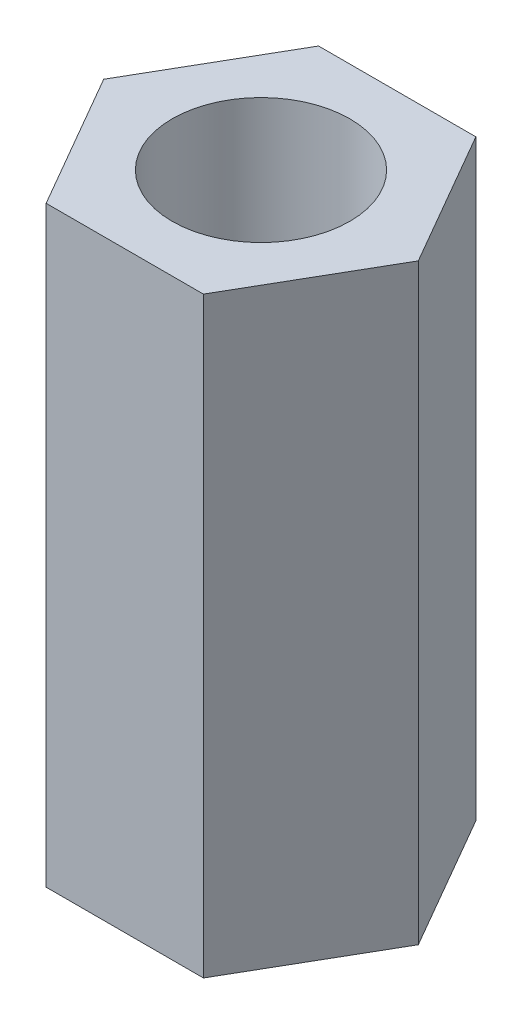
ISO-10303-21;
HEADER;
FILE_DESCRIPTION(('STEP AP214'),'2;1');
FILE_NAME('part.step','',(''),(''),'','','');
FILE_SCHEMA(('AUTOMOTIVE_DESIGN { 1 0 10303 214 1 1 1 1 }'));
ENDSEC;
DATA;
#1=APPLICATION_CONTEXT('core data for automotive mechanical design processes');
#2=APPLICATION_PROTOCOL_DEFINITION('international standard','automotive_design',2000,#1);
#3=PRODUCT_CONTEXT('',#1,'mechanical');
#4=PRODUCT('Part','Part','',(#3));
#5=PRODUCT_RELATED_PRODUCT_CATEGORY('part','',(#4));
#6=PRODUCT_DEFINITION_FORMATION('','',#4);
#7=PRODUCT_DEFINITION_CONTEXT('part definition',#1,'design');
#8=PRODUCT_DEFINITION('design','',#6,#7);
#9=PRODUCT_DEFINITION_SHAPE('','',#8);
#10=(LENGTH_UNIT() NAMED_UNIT(*) SI_UNIT(.MILLI.,.METRE.));
#11=(NAMED_UNIT(*) PLANE_ANGLE_UNIT() SI_UNIT($,.RADIAN.));
#12=(NAMED_UNIT(*) SI_UNIT($,.STERADIAN.) SOLID_ANGLE_UNIT());
#13=UNCERTAINTY_MEASURE_WITH_UNIT(LENGTH_MEASURE(1.E-05),#10,'distance_accuracy_value','');
#14=(GEOMETRIC_REPRESENTATION_CONTEXT(3) GLOBAL_UNCERTAINTY_ASSIGNED_CONTEXT((#13)) GLOBAL_UNIT_ASSIGNED_CONTEXT((#10,
#11,#12)) REPRESENTATION_CONTEXT('',''));
#15=CARTESIAN_POINT('',(0.,0.,0.));
#16=DIRECTION('',(0.,0.,1.));
#17=DIRECTION('',(1.,0.,0.));
#18=AXIS2_PLACEMENT_3D('',#15,#16,#17);
#19=CARTESIAN_POINT('',(0.,10.,0.));
#20=DIRECTION('',(0.,1.,0.));
#21=DIRECTION('',(0.,0.,1.));
#22=AXIS2_PLACEMENT_3D('',#19,#20,#21);
#23=PLANE('',#22);
#24=DIRECTION('',(1.,0.,0.));
#25=VECTOR('',#24,1.);
#26=CARTESIAN_POINT('',(-1.32790561913614,10.,2.3));
#27=LINE('',#26,#25);
#28=CARTESIAN_POINT('',(-1.32790561913614,10.,2.3));
#29=VERTEX_POINT('',#28);
#30=CARTESIAN_POINT('',(1.32790561913614,10.,2.3));
#31=VERTEX_POINT('',#30);
#32=EDGE_CURVE('E139',#29,#31,#27,.T.);
#33=ORIENTED_EDGE('',*,*,#32,.T.);
#34=DIRECTION('',(0.5,0.,-0.866025403784439));
#35=VECTOR('',#34,1.);
#36=CARTESIAN_POINT('',(1.32790561913614,10.,2.3));
#37=LINE('',#36,#35);
#38=CARTESIAN_POINT('',(2.65581123827228,10.,0.));
#39=VERTEX_POINT('',#38);
#40=EDGE_CURVE('E92',#31,#39,#37,.T.);
#41=ORIENTED_EDGE('',*,*,#40,.T.);
#42=DIRECTION('',(-0.5,0.,-0.866025403784438));
#43=VECTOR('',#42,1.);
#44=CARTESIAN_POINT('',(2.65581123827228,10.,0.));
#45=LINE('',#44,#43);
#46=CARTESIAN_POINT('',(1.32790561913614,10.,-2.3));
#47=VERTEX_POINT('',#46);
#48=EDGE_CURVE('E107',#39,#47,#45,.T.);
#49=ORIENTED_EDGE('',*,*,#48,.T.);
#50=DIRECTION('',(-1.,0.,0.));
#51=VECTOR('',#50,1.);
#52=CARTESIAN_POINT('',(1.32790561913614,10.,-2.3));
#53=LINE('',#52,#51);
#54=CARTESIAN_POINT('',(-1.32790561913614,10.,-2.3));
#55=VERTEX_POINT('',#54);
#56=EDGE_CURVE('E105',#47,#55,#53,.T.);
#57=ORIENTED_EDGE('',*,*,#56,.T.);
#58=DIRECTION('',(-0.5,0.,0.866025403784439));
#59=VECTOR('',#58,1.);
#60=CARTESIAN_POINT('',(-1.32790561913614,10.,-2.3));
#61=LINE('',#60,#59);
#62=CARTESIAN_POINT('',(-2.65581123827228,10.,0.));
#63=VERTEX_POINT('',#62);
#64=EDGE_CURVE('E106',#55,#63,#61,.T.);
#65=ORIENTED_EDGE('',*,*,#64,.T.);
#66=DIRECTION('',(0.5,0.,0.866025403784439));
#67=VECTOR('',#66,1.);
#68=CARTESIAN_POINT('',(-2.65581123827228,10.,0.));
#69=LINE('',#68,#67);
#70=EDGE_CURVE('E59',#63,#29,#69,.T.);
#71=ORIENTED_EDGE('',*,*,#70,.T.);
#72=EDGE_LOOP('',(#33,#41,#49,#57,#65,#71));
#73=FACE_BOUND('',#72,.T.);
#74=CARTESIAN_POINT('',(0.,10.,0.));
#75=DIRECTION('',(0.,1.,0.));
#76=DIRECTION('',(0.,0.,1.));
#77=AXIS2_PLACEMENT_3D('',#74,#75,#76);
#78=CIRCLE('',#77,1.5);
#79=CARTESIAN_POINT('',(0.,10.,1.5));
#80=VERTEX_POINT('',#79);
#81=EDGE_CURVE('E128',#80,#80,#78,.T.);
#82=ORIENTED_EDGE('',*,*,#81,.F.);
#83=EDGE_LOOP('',(#82));
#84=FACE_BOUND('',#83,.T.);
#85=ADVANCED_FACE('F41',(#73,#84),#23,.T.);
#86=CARTESIAN_POINT('',(0.,0.,0.));
#87=DIRECTION('',(0.,1.,0.));
#88=DIRECTION('',(0.,0.,1.));
#89=AXIS2_PLACEMENT_3D('',#86,#87,#88);
#90=PLANE('',#89);
#91=DIRECTION('',(1.,0.,0.));
#92=VECTOR('',#91,1.);
#93=CARTESIAN_POINT('',(-1.32790561913614,0.,2.3));
#94=LINE('',#93,#92);
#95=CARTESIAN_POINT('',(-1.32790561913614,0.,2.3));
#96=VERTEX_POINT('',#95);
#97=CARTESIAN_POINT('',(1.32790561913614,0.,2.3));
#98=VERTEX_POINT('',#97);
#99=EDGE_CURVE('E127',#96,#98,#94,.T.);
#100=ORIENTED_EDGE('',*,*,#99,.F.);
#101=DIRECTION('',(0.5,0.,0.866025403784439));
#102=VECTOR('',#101,1.);
#103=CARTESIAN_POINT('',(-2.65581123827228,0.,0.));
#104=LINE('',#103,#102);
#105=CARTESIAN_POINT('',(-2.65581123827228,0.,0.));
#106=VERTEX_POINT('',#105);
#107=EDGE_CURVE('E87',#106,#96,#104,.T.);
#108=ORIENTED_EDGE('',*,*,#107,.F.);
#109=DIRECTION('',(-0.5,0.,0.866025403784439));
#110=VECTOR('',#109,1.);
#111=CARTESIAN_POINT('',(-1.32790561913614,0.,-2.3));
#112=LINE('',#111,#110);
#113=CARTESIAN_POINT('',(-1.32790561913614,0.,-2.3));
#114=VERTEX_POINT('',#113);
#115=EDGE_CURVE('E82',#114,#106,#112,.T.);
#116=ORIENTED_EDGE('',*,*,#115,.F.);
#117=DIRECTION('',(-1.,0.,0.));
#118=VECTOR('',#117,1.);
#119=CARTESIAN_POINT('',(1.32790561913614,0.,-2.3));
#120=LINE('',#119,#118);
#121=CARTESIAN_POINT('',(1.32790561913614,0.,-2.3));
#122=VERTEX_POINT('',#121);
#123=EDGE_CURVE('E116',#122,#114,#120,.T.);
#124=ORIENTED_EDGE('',*,*,#123,.F.);
#125=DIRECTION('',(-0.5,0.,-0.866025403784438));
#126=VECTOR('',#125,1.);
#127=CARTESIAN_POINT('',(2.65581123827228,0.,0.));
#128=LINE('',#127,#126);
#129=CARTESIAN_POINT('',(2.65581123827228,0.,0.));
#130=VERTEX_POINT('',#129);
#131=EDGE_CURVE('E135',#130,#122,#128,.T.);
#132=ORIENTED_EDGE('',*,*,#131,.F.);
#133=DIRECTION('',(0.5,0.,-0.866025403784439));
#134=VECTOR('',#133,1.);
#135=CARTESIAN_POINT('',(1.32790561913614,0.,2.3));
#136=LINE('',#135,#134);
#137=EDGE_CURVE('E129',#98,#130,#136,.T.);
#138=ORIENTED_EDGE('',*,*,#137,.F.);
#139=EDGE_LOOP('',(#100,#108,#116,#124,#132,#138));
#140=FACE_BOUND('',#139,.T.);
#141=CARTESIAN_POINT('',(0.,0.,0.));
#142=DIRECTION('',(0.,1.,0.));
#143=DIRECTION('',(0.,0.,1.));
#144=AXIS2_PLACEMENT_3D('',#141,#142,#143);
#145=CIRCLE('',#144,1.5);
#146=CARTESIAN_POINT('',(0.,0.,1.5));
#147=VERTEX_POINT('',#146);
#148=EDGE_CURVE('E229',#147,#147,#145,.T.);
#149=ORIENTED_EDGE('',*,*,#148,.T.);
#150=EDGE_LOOP('',(#149));
#151=FACE_BOUND('',#150,.T.);
#152=ADVANCED_FACE('F148',(#140,#151),#90,.F.);
#153=CARTESIAN_POINT('',(-1.32790561913614,10.,2.3));
#154=DIRECTION('',(0.,0.,-1.));
#155=DIRECTION('',(-1.,0.,0.));
#156=AXIS2_PLACEMENT_3D('',#153,#154,#155);
#157=PLANE('',#156);
#158=ORIENTED_EDGE('',*,*,#99,.T.);
#159=DIRECTION('',(0.,-1.,0.));
#160=VECTOR('',#159,1.);
#161=CARTESIAN_POINT('',(1.32790561913614,10.,2.3));
#162=LINE('',#161,#160);
#163=EDGE_CURVE('E11',#31,#98,#162,.T.);
#164=ORIENTED_EDGE('',*,*,#163,.F.);
#165=ORIENTED_EDGE('',*,*,#32,.F.);
#166=DIRECTION('',(0.,-1.,0.));
#167=VECTOR('',#166,1.);
#168=CARTESIAN_POINT('',(-1.32790561913614,10.,2.3));
#169=LINE('',#168,#167);
#170=EDGE_CURVE('E124',#29,#96,#169,.T.);
#171=ORIENTED_EDGE('',*,*,#170,.T.);
#172=EDGE_LOOP('',(#158,#164,#165,#171));
#173=FACE_BOUND('',#172,.T.);
#174=ADVANCED_FACE('F43',(#173),#157,.F.);
#175=CARTESIAN_POINT('',(1.32790561913614,10.,2.3));
#176=DIRECTION('',(-0.866025403784439,0.,-0.5));
#177=DIRECTION('',(-0.5,0.,0.866025403784439));
#178=AXIS2_PLACEMENT_3D('',#175,#176,#177);
#179=PLANE('',#178);
#180=ORIENTED_EDGE('',*,*,#137,.T.);
#181=DIRECTION('',(0.,-1.,0.));
#182=VECTOR('',#181,1.);
#183=CARTESIAN_POINT('',(2.65581123827228,10.,0.));
#184=LINE('',#183,#182);
#185=EDGE_CURVE('E49',#39,#130,#184,.T.);
#186=ORIENTED_EDGE('',*,*,#185,.F.);
#187=ORIENTED_EDGE('',*,*,#40,.F.);
#188=ORIENTED_EDGE('',*,*,#163,.T.);
#189=EDGE_LOOP('',(#180,#186,#187,#188));
#190=FACE_BOUND('',#189,.T.);
#191=ADVANCED_FACE('F171',(#190),#179,.F.);
#192=CARTESIAN_POINT('',(2.65581123827228,10.,0.));
#193=DIRECTION('',(-0.866025403784438,0.,0.5));
#194=DIRECTION('',(0.5,0.,0.866025403784439));
#195=AXIS2_PLACEMENT_3D('',#192,#193,#194);
#196=PLANE('',#195);
#197=ORIENTED_EDGE('',*,*,#131,.T.);
#198=DIRECTION('',(0.,-1.,0.));
#199=VECTOR('',#198,1.);
#200=CARTESIAN_POINT('',(1.32790561913614,10.,-2.3));
#201=LINE('',#200,#199);
#202=EDGE_CURVE('E120',#47,#122,#201,.T.);
#203=ORIENTED_EDGE('',*,*,#202,.F.);
#204=ORIENTED_EDGE('',*,*,#48,.F.);
#205=ORIENTED_EDGE('',*,*,#185,.T.);
#206=EDGE_LOOP('',(#197,#203,#204,#205));
#207=FACE_BOUND('',#206,.T.);
#208=ADVANCED_FACE('F141',(#207),#196,.F.);
#209=CARTESIAN_POINT('',(1.32790561913614,10.,-2.3));
#210=DIRECTION('',(0.,0.,1.));
#211=DIRECTION('',(1.,0.,0.));
#212=AXIS2_PLACEMENT_3D('',#209,#210,#211);
#213=PLANE('',#212);
#214=ORIENTED_EDGE('',*,*,#123,.T.);
#215=DIRECTION('',(0.,-1.,0.));
#216=VECTOR('',#215,1.);
#217=CARTESIAN_POINT('',(-1.32790561913614,10.,-2.3));
#218=LINE('',#217,#216);
#219=EDGE_CURVE('E114',#55,#114,#218,.T.);
#220=ORIENTED_EDGE('',*,*,#219,.F.);
#221=ORIENTED_EDGE('',*,*,#56,.F.);
#222=ORIENTED_EDGE('',*,*,#202,.T.);
#223=EDGE_LOOP('',(#214,#220,#221,#222));
#224=FACE_BOUND('',#223,.T.);
#225=ADVANCED_FACE('F111',(#224),#213,.F.);
#226=CARTESIAN_POINT('',(-1.32790561913614,10.,-2.3));
#227=DIRECTION('',(0.866025403784439,0.,0.5));
#228=DIRECTION('',(0.5,0.,-0.866025403784439));
#229=AXIS2_PLACEMENT_3D('',#226,#227,#228);
#230=PLANE('',#229);
#231=ORIENTED_EDGE('',*,*,#115,.T.);
#232=DIRECTION('',(0.,-1.,0.));
#233=VECTOR('',#232,1.);
#234=CARTESIAN_POINT('',(-2.65581123827228,10.,0.));
#235=LINE('',#234,#233);
#236=EDGE_CURVE('E117',#63,#106,#235,.T.);
#237=ORIENTED_EDGE('',*,*,#236,.F.);
#238=ORIENTED_EDGE('',*,*,#64,.F.);
#239=ORIENTED_EDGE('',*,*,#219,.T.);
#240=EDGE_LOOP('',(#231,#237,#238,#239));
#241=FACE_BOUND('',#240,.T.);
#242=ADVANCED_FACE('F119',(#241),#230,.F.);
#243=CARTESIAN_POINT('',(-2.65581123827228,10.,0.));
#244=DIRECTION('',(0.866025403784438,0.,-0.5));
#245=DIRECTION('',(-0.5,0.,-0.866025403784439));
#246=AXIS2_PLACEMENT_3D('',#243,#244,#245);
#247=PLANE('',#246);
#248=ORIENTED_EDGE('',*,*,#107,.T.);
#249=ORIENTED_EDGE('',*,*,#170,.F.);
#250=ORIENTED_EDGE('',*,*,#70,.F.);
#251=ORIENTED_EDGE('',*,*,#236,.T.);
#252=EDGE_LOOP('',(#248,#249,#250,#251));
#253=FACE_BOUND('',#252,.T.);
#254=ADVANCED_FACE('F151',(#253),#247,.F.);
#255=CARTESIAN_POINT('',(0.,10.,0.));
#256=DIRECTION('',(0.,-1.,0.));
#257=DIRECTION('',(0.,0.,-1.));
#258=AXIS2_PLACEMENT_3D('',#255,#256,#257);
#259=CYLINDRICAL_SURFACE('',#258,1.5);
#260=ORIENTED_EDGE('',*,*,#81,.T.);
#261=EDGE_LOOP('',(#260));
#262=FACE_BOUND('',#261,.T.);
#263=ORIENTED_EDGE('',*,*,#148,.F.);
#264=EDGE_LOOP('',(#263));
#265=FACE_BOUND('',#264,.T.);
#266=ADVANCED_FACE('F153',(#262,#265),#259,.F.);
#267=CLOSED_SHELL('',(#85,#152,#174,#191,#208,#225,#242,#254,#266));
#268=MANIFOLD_SOLID_BREP('B2',#267);
#269=ADVANCED_BREP_SHAPE_REPRESENTATION('',(#18,#268),#14);
#270=SHAPE_DEFINITION_REPRESENTATION(#9,#269);
ENDSEC;
END-ISO-10303-21;
